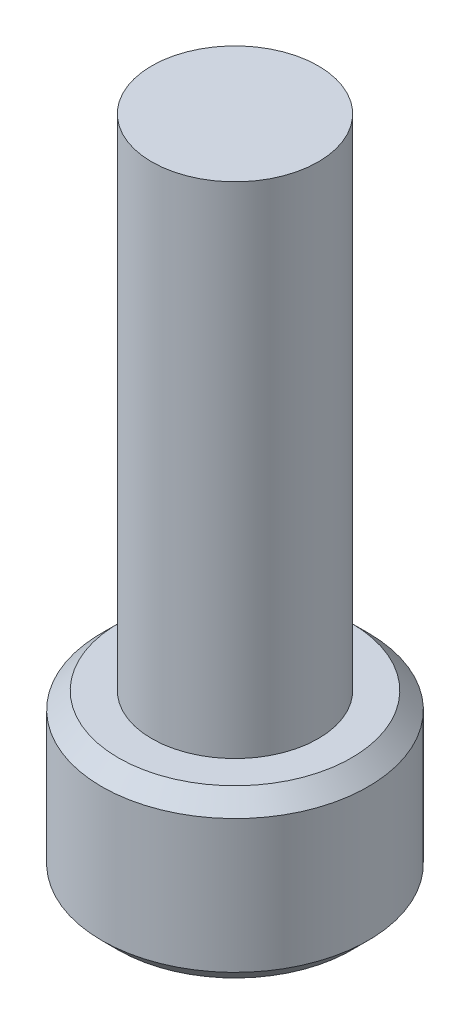
ISO-10303-21;
HEADER;
FILE_DESCRIPTION(('STEP AP214'),'2;1');
FILE_NAME('part.step','',(''),(''),'','','');
FILE_SCHEMA(('AUTOMOTIVE_DESIGN { 1 0 10303 214 1 1 1 1 }'));
ENDSEC;
DATA;
#1=APPLICATION_CONTEXT('core data for automotive mechanical design processes');
#2=APPLICATION_PROTOCOL_DEFINITION('international standard','automotive_design',2000,#1);
#3=PRODUCT_CONTEXT('',#1,'mechanical');
#4=PRODUCT('Part','Part','',(#3));
#5=PRODUCT_RELATED_PRODUCT_CATEGORY('part','',(#4));
#6=PRODUCT_DEFINITION_FORMATION('','',#4);
#7=PRODUCT_DEFINITION_CONTEXT('part definition',#1,'design');
#8=PRODUCT_DEFINITION('design','',#6,#7);
#9=PRODUCT_DEFINITION_SHAPE('','',#8);
#10=(LENGTH_UNIT() NAMED_UNIT(*) SI_UNIT(.MILLI.,.METRE.));
#11=(NAMED_UNIT(*) PLANE_ANGLE_UNIT() SI_UNIT($,.RADIAN.));
#12=(NAMED_UNIT(*) SI_UNIT($,.STERADIAN.) SOLID_ANGLE_UNIT());
#13=UNCERTAINTY_MEASURE_WITH_UNIT(LENGTH_MEASURE(1.E-05),#10,'distance_accuracy_value','');
#14=(GEOMETRIC_REPRESENTATION_CONTEXT(3) GLOBAL_UNCERTAINTY_ASSIGNED_CONTEXT((#13)) GLOBAL_UNIT_ASSIGNED_CONTEXT((#10,
#11,#12)) REPRESENTATION_CONTEXT('',''));
#15=CARTESIAN_POINT('',(0.,0.,0.));
#16=DIRECTION('',(0.,0.,1.));
#17=DIRECTION('',(1.,0.,0.));
#18=AXIS2_PLACEMENT_3D('',#15,#16,#17);
#19=CARTESIAN_POINT('',(0.,15.,0.));
#20=DIRECTION('',(0.,-1.,0.));
#21=DIRECTION('',(0.,0.,-1.));
#22=AXIS2_PLACEMENT_3D('',#19,#20,#21);
#23=CYLINDRICAL_SURFACE('',#22,2.5);
#24=CARTESIAN_POINT('',(0.,15.,0.));
#25=DIRECTION('',(0.,1.,0.));
#26=DIRECTION('',(0.,0.,1.));
#27=AXIS2_PLACEMENT_3D('',#24,#25,#26);
#28=CIRCLE('',#27,2.5);
#29=CARTESIAN_POINT('',(0.,15.,2.5));
#30=VERTEX_POINT('',#29);
#31=EDGE_CURVE('E126',#30,#30,#28,.T.);
#32=ORIENTED_EDGE('',*,*,#31,.F.);
#33=EDGE_LOOP('',(#32));
#34=FACE_BOUND('',#33,.T.);
#35=CARTESIAN_POINT('',(0.,0.,0.));
#36=DIRECTION('',(0.,-1.,0.));
#37=DIRECTION('',(0.,0.,-1.));
#38=AXIS2_PLACEMENT_3D('',#35,#36,#37);
#39=CIRCLE('',#38,2.5);
#40=CARTESIAN_POINT('',(0.,0.,-2.5));
#41=VERTEX_POINT('',#40);
#42=EDGE_CURVE('E116',#41,#41,#39,.T.);
#43=ORIENTED_EDGE('',*,*,#42,.F.);
#44=EDGE_LOOP('',(#43));
#45=FACE_BOUND('',#44,.T.);
#46=ADVANCED_FACE('F32',(#34,#45),#23,.T.);
#47=CARTESIAN_POINT('',(0.,15.,0.));
#48=DIRECTION('',(0.,1.,0.));
#49=DIRECTION('',(0.,0.,1.));
#50=AXIS2_PLACEMENT_3D('',#47,#48,#49);
#51=PLANE('',#50);
#52=ORIENTED_EDGE('',*,*,#31,.T.);
#53=EDGE_LOOP('',(#52));
#54=FACE_BOUND('',#53,.T.);
#55=ADVANCED_FACE('F184',(#54),#51,.T.);
#56=CARTESIAN_POINT('',(0.,0.,0.));
#57=DIRECTION('',(0.,-1.,0.));
#58=DIRECTION('',(0.,0.,-1.));
#59=AXIS2_PLACEMENT_3D('',#56,#57,#58);
#60=PLANE('',#59);
#61=CARTESIAN_POINT('',(0.,0.,0.));
#62=DIRECTION('',(0.,-1.,0.));
#63=DIRECTION('',(0.,0.,-1.));
#64=AXIS2_PLACEMENT_3D('',#61,#62,#63);
#65=CIRCLE('',#64,3.49999999999999);
#66=CARTESIAN_POINT('',(0.,0.,-3.49999999999999));
#67=VERTEX_POINT('',#66);
#68=EDGE_CURVE('E11',#67,#67,#65,.F.);
#69=ORIENTED_EDGE('',*,*,#68,.T.);
#70=EDGE_LOOP('',(#69));
#71=FACE_BOUND('',#70,.T.);
#72=ORIENTED_EDGE('',*,*,#42,.T.);
#73=EDGE_LOOP('',(#72));
#74=FACE_BOUND('',#73,.T.);
#75=ADVANCED_FACE('F190',(#71,#74),#60,.F.);
#76=CARTESIAN_POINT('',(0.,-5.,0.));
#77=DIRECTION('',(0.,-1.,0.));
#78=DIRECTION('',(0.,0.,-1.));
#79=AXIS2_PLACEMENT_3D('',#76,#77,#78);
#80=CYLINDRICAL_SURFACE('',#79,4.);
#81=CARTESIAN_POINT('',(0.,-4.49999999999999,0.));
#82=DIRECTION('',(0.,1.,0.));
#83=DIRECTION('',(0.,0.,1.));
#84=AXIS2_PLACEMENT_3D('',#81,#82,#83);
#85=CIRCLE('',#84,4.);
#86=CARTESIAN_POINT('',(0.,-4.49999999999999,4.));
#87=VERTEX_POINT('',#86);
#88=EDGE_CURVE('E40',#87,#87,#85,.T.);
#89=ORIENTED_EDGE('',*,*,#88,.T.);
#90=EDGE_LOOP('',(#89));
#91=FACE_BOUND('',#90,.T.);
#92=CARTESIAN_POINT('',(0.,-0.500000000000009,0.));
#93=DIRECTION('',(0.,-1.,0.));
#94=DIRECTION('',(0.,0.,-1.));
#95=AXIS2_PLACEMENT_3D('',#92,#93,#94);
#96=CIRCLE('',#95,4.);
#97=CARTESIAN_POINT('',(0.,-0.500000000000009,-4.));
#98=VERTEX_POINT('',#97);
#99=EDGE_CURVE('E146',#98,#98,#96,.T.);
#100=ORIENTED_EDGE('',*,*,#99,.T.);
#101=EDGE_LOOP('',(#100));
#102=FACE_BOUND('',#101,.T.);
#103=ADVANCED_FACE('F151',(#91,#102),#80,.T.);
#104=CARTESIAN_POINT('',(-4.,-5.,0.));
#105=DIRECTION('',(0.,1.,0.));
#106=DIRECTION('',(0.,0.,1.));
#107=AXIS2_PLACEMENT_3D('',#104,#105,#106);
#108=PLANE('',#107);
#109=CARTESIAN_POINT('',(0.,-5.,0.));
#110=DIRECTION('',(0.,1.,0.));
#111=DIRECTION('',(0.,0.,1.));
#112=AXIS2_PLACEMENT_3D('',#109,#110,#111);
#113=CIRCLE('',#112,3.5);
#114=CARTESIAN_POINT('',(0.,-5.,3.5));
#115=VERTEX_POINT('',#114);
#116=EDGE_CURVE('E143',#115,#115,#113,.F.);
#117=ORIENTED_EDGE('',*,*,#116,.T.);
#118=EDGE_LOOP('',(#117));
#119=FACE_BOUND('',#118,.T.);
#120=DIRECTION('',(1.,0.,0.));
#121=VECTOR('',#120,1.);
#122=CARTESIAN_POINT('',(-4.,-5.,2.5));
#123=LINE('',#122,#121);
#124=CARTESIAN_POINT('',(-1.44337567297406,-5.,2.5));
#125=VERTEX_POINT('',#124);
#126=CARTESIAN_POINT('',(1.44337567297407,-5.,2.5));
#127=VERTEX_POINT('',#126);
#128=EDGE_CURVE('E139',#125,#127,#123,.T.);
#129=ORIENTED_EDGE('',*,*,#128,.T.);
#130=DIRECTION('',(0.5,0.,-0.866025403784439));
#131=VECTOR('',#130,1.);
#132=CARTESIAN_POINT('',(1.1650635094611,-5.,2.98205080756888));
#133=LINE('',#132,#131);
#134=CARTESIAN_POINT('',(2.88675134594813,-5.,0.));
#135=VERTEX_POINT('',#134);
#136=EDGE_CURVE('E55',#127,#135,#133,.T.);
#137=ORIENTED_EDGE('',*,*,#136,.T.);
#138=DIRECTION('',(-0.5,0.,-0.866025403784439));
#139=VECTOR('',#138,1.);
#140=CARTESIAN_POINT('',(1.1650635094611,-5.,-2.98205080756888));
#141=LINE('',#140,#139);
#142=CARTESIAN_POINT('',(1.44337567297406,-5.,-2.5));
#143=VERTEX_POINT('',#142);
#144=EDGE_CURVE('E88',#135,#143,#141,.T.);
#145=ORIENTED_EDGE('',*,*,#144,.T.);
#146=DIRECTION('',(-1.,0.,0.));
#147=VECTOR('',#146,1.);
#148=CARTESIAN_POINT('',(-4.,-5.,-2.5));
#149=LINE('',#148,#147);
#150=CARTESIAN_POINT('',(-1.44337567297406,-5.,-2.5));
#151=VERTEX_POINT('',#150);
#152=EDGE_CURVE('E130',#143,#151,#149,.T.);
#153=ORIENTED_EDGE('',*,*,#152,.T.);
#154=DIRECTION('',(-0.5,0.,0.866025403784439));
#155=VECTOR('',#154,1.);
#156=CARTESIAN_POINT('',(-3.1650635094611,-5.,0.482050807568877));
#157=LINE('',#156,#155);
#158=CARTESIAN_POINT('',(-2.88675134594813,-5.,0.));
#159=VERTEX_POINT('',#158);
#160=EDGE_CURVE('E133',#151,#159,#157,.T.);
#161=ORIENTED_EDGE('',*,*,#160,.T.);
#162=DIRECTION('',(0.5,0.,0.866025403784439));
#163=VECTOR('',#162,1.);
#164=CARTESIAN_POINT('',(-3.1650635094611,-5.,-0.482050807568877));
#165=LINE('',#164,#163);
#166=EDGE_CURVE('E136',#159,#125,#165,.T.);
#167=ORIENTED_EDGE('',*,*,#166,.T.);
#168=EDGE_LOOP('',(#129,#137,#145,#153,#161,#167));
#169=FACE_BOUND('',#168,.T.);
#170=ADVANCED_FACE('F159',(#119,#169),#108,.F.);
#171=CARTESIAN_POINT('',(1.44337567297407,-31.,2.5));
#172=DIRECTION('',(0.866025403784439,0.,0.5));
#173=DIRECTION('',(0.5,0.,-0.866025403784439));
#174=AXIS2_PLACEMENT_3D('',#171,#172,#173);
#175=PLANE('',#174);
#176=DIRECTION('',(0.,1.,0.));
#177=VECTOR('',#176,1.);
#178=CARTESIAN_POINT('',(1.44337567297407,-31.,2.5));
#179=LINE('',#178,#177);
#180=CARTESIAN_POINT('',(1.44337567297407,-1.,2.5));
#181=VERTEX_POINT('',#180);
#182=EDGE_CURVE('E104',#127,#181,#179,.T.);
#183=ORIENTED_EDGE('',*,*,#182,.T.);
#184=DIRECTION('',(0.5,0.,-0.866025403784439));
#185=VECTOR('',#184,1.);
#186=CARTESIAN_POINT('',(1.44337567297407,-1.,2.5));
#187=LINE('',#186,#185);
#188=CARTESIAN_POINT('',(2.88675134594813,-1.,0.));
#189=VERTEX_POINT('',#188);
#190=EDGE_CURVE('E97',#181,#189,#187,.T.);
#191=ORIENTED_EDGE('',*,*,#190,.T.);
#192=DIRECTION('',(0.,1.,0.));
#193=VECTOR('',#192,1.);
#194=CARTESIAN_POINT('',(2.88675134594813,-31.,0.));
#195=LINE('',#194,#193);
#196=EDGE_CURVE('E83',#135,#189,#195,.T.);
#197=ORIENTED_EDGE('',*,*,#196,.F.);
#198=ORIENTED_EDGE('',*,*,#136,.F.);
#199=EDGE_LOOP('',(#183,#191,#197,#198));
#200=FACE_BOUND('',#199,.T.);
#201=ADVANCED_FACE('F103',(#200),#175,.F.);
#202=CARTESIAN_POINT('',(-1.44337567297406,-31.,2.5));
#203=DIRECTION('',(0.,0.,1.));
#204=DIRECTION('',(1.,0.,0.));
#205=AXIS2_PLACEMENT_3D('',#202,#203,#204);
#206=PLANE('',#205);
#207=DIRECTION('',(0.,1.,0.));
#208=VECTOR('',#207,1.);
#209=CARTESIAN_POINT('',(-1.44337567297406,-31.,2.5));
#210=LINE('',#209,#208);
#211=CARTESIAN_POINT('',(-1.44337567297406,-1.,2.5));
#212=VERTEX_POINT('',#211);
#213=EDGE_CURVE('E117',#125,#212,#210,.T.);
#214=ORIENTED_EDGE('',*,*,#213,.T.);
#215=DIRECTION('',(1.,0.,0.));
#216=VECTOR('',#215,1.);
#217=CARTESIAN_POINT('',(-1.44337567297406,-1.,2.5));
#218=LINE('',#217,#216);
#219=EDGE_CURVE('E90',#212,#181,#218,.T.);
#220=ORIENTED_EDGE('',*,*,#219,.T.);
#221=ORIENTED_EDGE('',*,*,#182,.F.);
#222=ORIENTED_EDGE('',*,*,#128,.F.);
#223=EDGE_LOOP('',(#214,#220,#221,#222));
#224=FACE_BOUND('',#223,.T.);
#225=ADVANCED_FACE('F165',(#224),#206,.F.);
#226=CARTESIAN_POINT('',(-2.88675134594813,-31.,0.));
#227=DIRECTION('',(-0.866025403784439,0.,0.5));
#228=DIRECTION('',(0.5,0.,0.866025403784439));
#229=AXIS2_PLACEMENT_3D('',#226,#227,#228);
#230=PLANE('',#229);
#231=DIRECTION('',(0.,1.,0.));
#232=VECTOR('',#231,1.);
#233=CARTESIAN_POINT('',(-2.88675134594813,-31.,0.));
#234=LINE('',#233,#232);
#235=CARTESIAN_POINT('',(-2.88675134594813,-1.,0.));
#236=VERTEX_POINT('',#235);
#237=EDGE_CURVE('E119',#159,#236,#234,.T.);
#238=ORIENTED_EDGE('',*,*,#237,.T.);
#239=DIRECTION('',(0.5,0.,0.866025403784439));
#240=VECTOR('',#239,1.);
#241=CARTESIAN_POINT('',(-2.88675134594813,-1.,0.));
#242=LINE('',#241,#240);
#243=EDGE_CURVE('E111',#236,#212,#242,.T.);
#244=ORIENTED_EDGE('',*,*,#243,.T.);
#245=ORIENTED_EDGE('',*,*,#213,.F.);
#246=ORIENTED_EDGE('',*,*,#166,.F.);
#247=EDGE_LOOP('',(#238,#244,#245,#246));
#248=FACE_BOUND('',#247,.T.);
#249=ADVANCED_FACE('F167',(#248),#230,.F.);
#250=CARTESIAN_POINT('',(-1.44337567297406,-31.,-2.5));
#251=DIRECTION('',(-0.866025403784439,0.,-0.5));
#252=DIRECTION('',(-0.5,0.,0.866025403784439));
#253=AXIS2_PLACEMENT_3D('',#250,#251,#252);
#254=PLANE('',#253);
#255=DIRECTION('',(0.,1.,0.));
#256=VECTOR('',#255,1.);
#257=CARTESIAN_POINT('',(-1.44337567297406,-31.,-2.5));
#258=LINE('',#257,#256);
#259=CARTESIAN_POINT('',(-1.44337567297406,-1.,-2.5));
#260=VERTEX_POINT('',#259);
#261=EDGE_CURVE('E121',#151,#260,#258,.T.);
#262=ORIENTED_EDGE('',*,*,#261,.T.);
#263=DIRECTION('',(-0.5,0.,0.866025403784439));
#264=VECTOR('',#263,1.);
#265=CARTESIAN_POINT('',(-1.44337567297406,-1.,-2.5));
#266=LINE('',#265,#264);
#267=EDGE_CURVE('E108',#260,#236,#266,.T.);
#268=ORIENTED_EDGE('',*,*,#267,.T.);
#269=ORIENTED_EDGE('',*,*,#237,.F.);
#270=ORIENTED_EDGE('',*,*,#160,.F.);
#271=EDGE_LOOP('',(#262,#268,#269,#270));
#272=FACE_BOUND('',#271,.T.);
#273=ADVANCED_FACE('F171',(#272),#254,.F.);
#274=CARTESIAN_POINT('',(1.44337567297406,-31.,-2.5));
#275=DIRECTION('',(0.,0.,-1.));
#276=DIRECTION('',(-1.,0.,0.));
#277=AXIS2_PLACEMENT_3D('',#274,#275,#276);
#278=PLANE('',#277);
#279=DIRECTION('',(0.,1.,0.));
#280=VECTOR('',#279,1.);
#281=CARTESIAN_POINT('',(1.44337567297406,-31.,-2.5));
#282=LINE('',#281,#280);
#283=CARTESIAN_POINT('',(1.44337567297406,-1.,-2.5));
#284=VERTEX_POINT('',#283);
#285=EDGE_CURVE('E47',#143,#284,#282,.T.);
#286=ORIENTED_EDGE('',*,*,#285,.T.);
#287=DIRECTION('',(-1.,0.,0.));
#288=VECTOR('',#287,1.);
#289=CARTESIAN_POINT('',(1.44337567297406,-1.,-2.5));
#290=LINE('',#289,#288);
#291=EDGE_CURVE('E101',#284,#260,#290,.T.);
#292=ORIENTED_EDGE('',*,*,#291,.T.);
#293=ORIENTED_EDGE('',*,*,#261,.F.);
#294=ORIENTED_EDGE('',*,*,#152,.F.);
#295=EDGE_LOOP('',(#286,#292,#293,#294));
#296=FACE_BOUND('',#295,.T.);
#297=ADVANCED_FACE('F174',(#296),#278,.F.);
#298=CARTESIAN_POINT('',(2.88675134594813,-31.,0.));
#299=DIRECTION('',(0.866025403784438,0.,-0.5));
#300=DIRECTION('',(-0.5,0.,-0.866025403784439));
#301=AXIS2_PLACEMENT_3D('',#298,#299,#300);
#302=PLANE('',#301);
#303=ORIENTED_EDGE('',*,*,#196,.T.);
#304=DIRECTION('',(-0.5,0.,-0.866025403784439));
#305=VECTOR('',#304,1.);
#306=CARTESIAN_POINT('',(2.88675134594813,-1.,0.));
#307=LINE('',#306,#305);
#308=EDGE_CURVE('E86',#189,#284,#307,.T.);
#309=ORIENTED_EDGE('',*,*,#308,.T.);
#310=ORIENTED_EDGE('',*,*,#285,.F.);
#311=ORIENTED_EDGE('',*,*,#144,.F.);
#312=EDGE_LOOP('',(#303,#309,#310,#311));
#313=FACE_BOUND('',#312,.T.);
#314=ADVANCED_FACE('F85',(#313),#302,.F.);
#315=CARTESIAN_POINT('',(0.,-1.,0.));
#316=DIRECTION('',(0.,1.,0.));
#317=DIRECTION('',(0.,0.,1.));
#318=AXIS2_PLACEMENT_3D('',#315,#316,#317);
#319=PLANE('',#318);
#320=ORIENTED_EDGE('',*,*,#190,.F.);
#321=ORIENTED_EDGE('',*,*,#219,.F.);
#322=ORIENTED_EDGE('',*,*,#243,.F.);
#323=ORIENTED_EDGE('',*,*,#267,.F.);
#324=ORIENTED_EDGE('',*,*,#291,.F.);
#325=ORIENTED_EDGE('',*,*,#308,.F.);
#326=EDGE_LOOP('',(#320,#321,#322,#323,#324,#325));
#327=FACE_BOUND('',#326,.T.);
#328=ADVANCED_FACE('F95',(#327),#319,.F.);
#329=CARTESIAN_POINT('',(0.,-5.,0.));
#330=DIRECTION('',(0.,1.,0.));
#331=DIRECTION('',(0.,0.,1.));
#332=AXIS2_PLACEMENT_3D('',#329,#330,#331);
#333=CONICAL_SURFACE('',#332,3.5,0.785398163397445);
#334=ORIENTED_EDGE('',*,*,#88,.F.);
#335=EDGE_LOOP('',(#334));
#336=FACE_BOUND('',#335,.T.);
#337=ORIENTED_EDGE('',*,*,#116,.F.);
#338=EDGE_LOOP('',(#337));
#339=FACE_BOUND('',#338,.T.);
#340=ADVANCED_FACE('F154',(#336,#339),#333,.T.);
#341=CARTESIAN_POINT('',(0.,-0.500000000000009,0.));
#342=DIRECTION('',(0.,-1.,0.));
#343=DIRECTION('',(0.,0.,-1.));
#344=AXIS2_PLACEMENT_3D('',#341,#342,#343);
#345=CONICAL_SURFACE('',#344,4.,0.78539816339745);
#346=ORIENTED_EDGE('',*,*,#68,.F.);
#347=EDGE_LOOP('',(#346));
#348=FACE_BOUND('',#347,.T.);
#349=ORIENTED_EDGE('',*,*,#99,.F.);
#350=EDGE_LOOP('',(#349));
#351=FACE_BOUND('',#350,.T.);
#352=ADVANCED_FACE('F34',(#348,#351),#345,.T.);
#353=CLOSED_SHELL('',(#46,#55,#75,#103,#170,#201,#225,#249,#273,#297,#314,#328,#340,#352));
#354=MANIFOLD_SOLID_BREP('B2',#353);
#355=ADVANCED_BREP_SHAPE_REPRESENTATION('',(#18,#354),#14);
#356=SHAPE_DEFINITION_REPRESENTATION(#9,#355);
ENDSEC;
END-ISO-10303-21;
